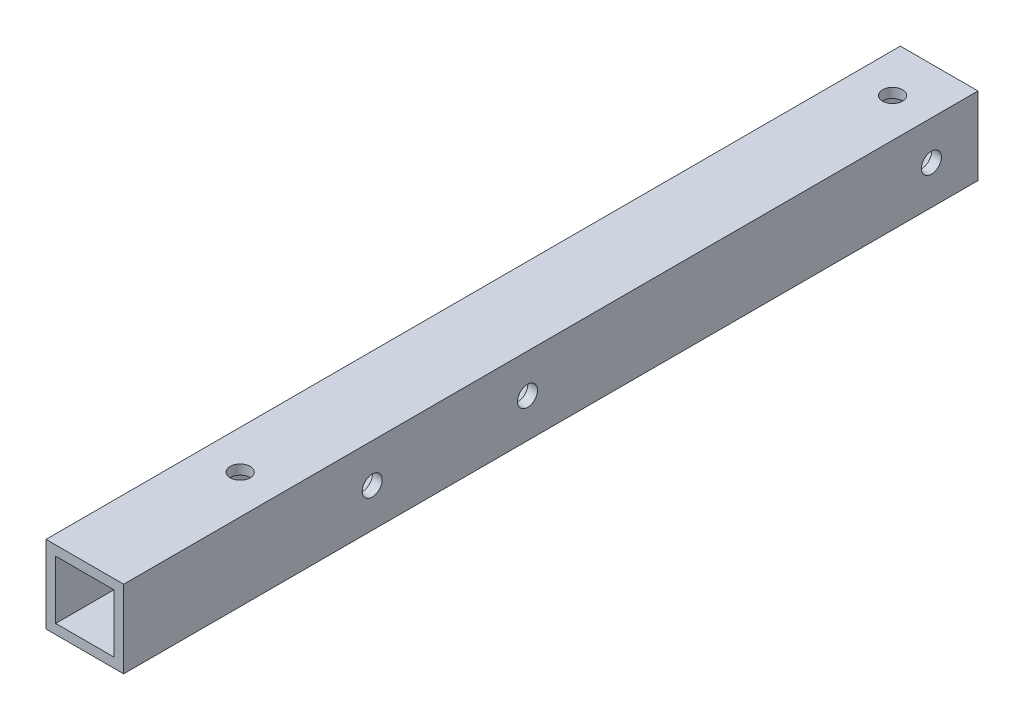
ISO-10303-21;
HEADER;
FILE_DESCRIPTION(('STEP AP214'),'2;1');
FILE_NAME('part.step','',(''),(''),'','','');
FILE_SCHEMA(('AUTOMOTIVE_DESIGN { 1 0 10303 214 1 1 1 1 }'));
ENDSEC;
DATA;
#1=APPLICATION_CONTEXT('core data for automotive mechanical design processes');
#2=APPLICATION_PROTOCOL_DEFINITION('international standard','automotive_design',2000,#1);
#3=PRODUCT_CONTEXT('',#1,'mechanical');
#4=PRODUCT('Part','Part','',(#3));
#5=PRODUCT_RELATED_PRODUCT_CATEGORY('part','',(#4));
#6=PRODUCT_DEFINITION_FORMATION('','',#4);
#7=PRODUCT_DEFINITION_CONTEXT('part definition',#1,'design');
#8=PRODUCT_DEFINITION('design','',#6,#7);
#9=PRODUCT_DEFINITION_SHAPE('','',#8);
#10=(LENGTH_UNIT() NAMED_UNIT(*) SI_UNIT(.MILLI.,.METRE.));
#11=(NAMED_UNIT(*) PLANE_ANGLE_UNIT() SI_UNIT($,.RADIAN.));
#12=(NAMED_UNIT(*) SI_UNIT($,.STERADIAN.) SOLID_ANGLE_UNIT());
#13=UNCERTAINTY_MEASURE_WITH_UNIT(LENGTH_MEASURE(1.E-05),#10,'distance_accuracy_value','');
#14=(GEOMETRIC_REPRESENTATION_CONTEXT(3) GLOBAL_UNCERTAINTY_ASSIGNED_CONTEXT((#13)) GLOBAL_UNIT_ASSIGNED_CONTEXT((#10,
#11,#12)) REPRESENTATION_CONTEXT('',''));
#15=CARTESIAN_POINT('',(0.,0.,0.));
#16=DIRECTION('',(0.,0.,1.));
#17=DIRECTION('',(1.,0.,0.));
#18=AXIS2_PLACEMENT_3D('',#15,#16,#17);
#19=CARTESIAN_POINT('',(0.,0.,279.4));
#20=DIRECTION('',(0.,0.,-1.));
#21=DIRECTION('',(-1.,0.,0.));
#22=AXIS2_PLACEMENT_3D('',#19,#20,#21);
#23=PLANE('',#22);
#24=DIRECTION('',(-1.,0.,0.));
#25=VECTOR('',#24,1.);
#26=CARTESIAN_POINT('',(12.7000000000001,-12.7,279.4));
#27=LINE('',#26,#25);
#28=CARTESIAN_POINT('',(12.7000000000001,-12.7,279.4));
#29=VERTEX_POINT('',#28);
#30=CARTESIAN_POINT('',(-12.6999999999999,-12.7,279.4));
#31=VERTEX_POINT('',#30);
#32=EDGE_CURVE('E143',#29,#31,#27,.T.);
#33=ORIENTED_EDGE('',*,*,#32,.F.);
#34=DIRECTION('',(0.,1.,0.));
#35=VECTOR('',#34,1.);
#36=CARTESIAN_POINT('',(12.7000000000001,-12.7,279.4));
#37=LINE('',#36,#35);
#38=CARTESIAN_POINT('',(12.7000000000001,12.7,279.4));
#39=VERTEX_POINT('',#38);
#40=EDGE_CURVE('E152',#29,#39,#37,.T.);
#41=ORIENTED_EDGE('',*,*,#40,.T.);
#42=DIRECTION('',(-1.,0.,0.));
#43=VECTOR('',#42,1.);
#44=CARTESIAN_POINT('',(12.7000000000001,12.7,279.4));
#45=LINE('',#44,#43);
#46=CARTESIAN_POINT('',(-12.6999999999999,12.7,279.4));
#47=VERTEX_POINT('',#46);
#48=EDGE_CURVE('E150',#39,#47,#45,.T.);
#49=ORIENTED_EDGE('',*,*,#48,.T.);
#50=DIRECTION('',(0.,1.,0.));
#51=VECTOR('',#50,1.);
#52=CARTESIAN_POINT('',(-12.6999999999999,-12.7,279.4));
#53=LINE('',#52,#51);
#54=EDGE_CURVE('E146',#31,#47,#53,.T.);
#55=ORIENTED_EDGE('',*,*,#54,.F.);
#56=EDGE_LOOP('',(#33,#41,#49,#55));
#57=FACE_BOUND('',#56,.T.);
#58=DIRECTION('',(0.,1.,0.));
#59=VECTOR('',#58,1.);
#60=CARTESIAN_POINT('',(9.52500000000005,-9.52499999999999,279.4));
#61=LINE('',#60,#59);
#62=CARTESIAN_POINT('',(9.52500000000005,-9.52499999999999,279.4));
#63=VERTEX_POINT('',#62);
#64=CARTESIAN_POINT('',(9.52500000000005,9.52499999999999,279.4));
#65=VERTEX_POINT('',#64);
#66=EDGE_CURVE('E105',#63,#65,#61,.T.);
#67=ORIENTED_EDGE('',*,*,#66,.F.);
#68=DIRECTION('',(1.,0.,0.));
#69=VECTOR('',#68,1.);
#70=CARTESIAN_POINT('',(-9.52500000000006,-9.52499999999999,279.4));
#71=LINE('',#70,#69);
#72=CARTESIAN_POINT('',(-9.52500000000006,-9.52499999999999,279.4));
#73=VERTEX_POINT('',#72);
#74=EDGE_CURVE('E127',#73,#63,#71,.T.);
#75=ORIENTED_EDGE('',*,*,#74,.F.);
#76=DIRECTION('',(0.,-1.,0.));
#77=VECTOR('',#76,1.);
#78=CARTESIAN_POINT('',(-9.52500000000006,-9.52499999999999,279.4));
#79=LINE('',#78,#77);
#80=CARTESIAN_POINT('',(-9.52500000000006,9.52499999999999,279.4));
#81=VERTEX_POINT('',#80);
#82=EDGE_CURVE('E125',#81,#73,#79,.T.);
#83=ORIENTED_EDGE('',*,*,#82,.F.);
#84=DIRECTION('',(-1.,0.,0.));
#85=VECTOR('',#84,1.);
#86=CARTESIAN_POINT('',(-9.52500000000006,9.52499999999999,279.4));
#87=LINE('',#86,#85);
#88=EDGE_CURVE('E113',#65,#81,#87,.T.);
#89=ORIENTED_EDGE('',*,*,#88,.F.);
#90=EDGE_LOOP('',(#67,#75,#83,#89));
#91=FACE_BOUND('',#90,.T.);
#92=ADVANCED_FACE('F39',(#57,#91),#23,.F.);
#93=CARTESIAN_POINT('',(0.,0.,0.));
#94=DIRECTION('',(0.,0.,-1.));
#95=DIRECTION('',(-1.,0.,0.));
#96=AXIS2_PLACEMENT_3D('',#93,#94,#95);
#97=PLANE('',#96);
#98=DIRECTION('',(-1.,0.,0.));
#99=VECTOR('',#98,1.);
#100=CARTESIAN_POINT('',(12.7000000000001,-12.7,0.));
#101=LINE('',#100,#99);
#102=CARTESIAN_POINT('',(12.7000000000001,-12.7,0.));
#103=VERTEX_POINT('',#102);
#104=CARTESIAN_POINT('',(-12.6999999999999,-12.7,0.));
#105=VERTEX_POINT('',#104);
#106=EDGE_CURVE('E121',#103,#105,#101,.T.);
#107=ORIENTED_EDGE('',*,*,#106,.T.);
#108=DIRECTION('',(0.,1.,0.));
#109=VECTOR('',#108,1.);
#110=CARTESIAN_POINT('',(-12.6999999999999,-12.7,0.));
#111=LINE('',#110,#109);
#112=CARTESIAN_POINT('',(-12.6999999999999,12.7,0.));
#113=VERTEX_POINT('',#112);
#114=EDGE_CURVE('E157',#105,#113,#111,.T.);
#115=ORIENTED_EDGE('',*,*,#114,.T.);
#116=DIRECTION('',(-1.,0.,0.));
#117=VECTOR('',#116,1.);
#118=CARTESIAN_POINT('',(12.7000000000001,12.7,0.));
#119=LINE('',#118,#117);
#120=CARTESIAN_POINT('',(12.7000000000001,12.7,0.));
#121=VERTEX_POINT('',#120);
#122=EDGE_CURVE('E160',#121,#113,#119,.T.);
#123=ORIENTED_EDGE('',*,*,#122,.F.);
#124=DIRECTION('',(0.,1.,0.));
#125=VECTOR('',#124,1.);
#126=CARTESIAN_POINT('',(12.7000000000001,-12.7,0.));
#127=LINE('',#126,#125);
#128=EDGE_CURVE('E147',#103,#121,#127,.T.);
#129=ORIENTED_EDGE('',*,*,#128,.F.);
#130=EDGE_LOOP('',(#107,#115,#123,#129));
#131=FACE_BOUND('',#130,.T.);
#132=DIRECTION('',(1.,0.,0.));
#133=VECTOR('',#132,1.);
#134=CARTESIAN_POINT('',(-9.52500000000006,-9.52499999999999,0.));
#135=LINE('',#134,#133);
#136=CARTESIAN_POINT('',(-9.52500000000006,-9.52499999999999,0.));
#137=VERTEX_POINT('',#136);
#138=CARTESIAN_POINT('',(9.52500000000005,-9.52499999999999,0.));
#139=VERTEX_POINT('',#138);
#140=EDGE_CURVE('E114',#137,#139,#135,.T.);
#141=ORIENTED_EDGE('',*,*,#140,.T.);
#142=DIRECTION('',(0.,1.,0.));
#143=VECTOR('',#142,1.);
#144=CARTESIAN_POINT('',(9.52500000000005,-9.52499999999999,0.));
#145=LINE('',#144,#143);
#146=CARTESIAN_POINT('',(9.52500000000005,9.52499999999999,0.));
#147=VERTEX_POINT('',#146);
#148=EDGE_CURVE('E64',#139,#147,#145,.T.);
#149=ORIENTED_EDGE('',*,*,#148,.T.);
#150=DIRECTION('',(-1.,0.,0.));
#151=VECTOR('',#150,1.);
#152=CARTESIAN_POINT('',(-9.52500000000006,9.52499999999999,0.));
#153=LINE('',#152,#151);
#154=CARTESIAN_POINT('',(-9.52500000000006,9.52499999999999,0.));
#155=VERTEX_POINT('',#154);
#156=EDGE_CURVE('E120',#147,#155,#153,.T.);
#157=ORIENTED_EDGE('',*,*,#156,.T.);
#158=DIRECTION('',(0.,-1.,0.));
#159=VECTOR('',#158,1.);
#160=CARTESIAN_POINT('',(-9.52500000000006,-9.52499999999999,0.));
#161=LINE('',#160,#159);
#162=EDGE_CURVE('E135',#155,#137,#161,.T.);
#163=ORIENTED_EDGE('',*,*,#162,.T.);
#164=EDGE_LOOP('',(#141,#149,#157,#163));
#165=FACE_BOUND('',#164,.T.);
#166=ADVANCED_FACE('F247',(#131,#165),#97,.T.);
#167=CARTESIAN_POINT('',(12.7000000000001,-12.7,279.4));
#168=DIRECTION('',(0.,-1.,0.));
#169=DIRECTION('',(0.,0.,-1.));
#170=AXIS2_PLACEMENT_3D('',#167,#168,#169);
#171=PLANE('',#170);
#172=CARTESIAN_POINT('',(0.,-12.7,228.6));
#173=DIRECTION('',(0.,1.,0.));
#174=DIRECTION('',(0.,0.,1.));
#175=AXIS2_PLACEMENT_3D('',#172,#173,#174);
#176=CIRCLE('',#175,3.2639);
#177=CARTESIAN_POINT('',(0.,-12.7,231.8639));
#178=VERTEX_POINT('',#177);
#179=EDGE_CURVE('E177',#178,#178,#176,.T.);
#180=ORIENTED_EDGE('',*,*,#179,.T.);
#181=EDGE_LOOP('',(#180));
#182=FACE_BOUND('',#181,.T.);
#183=CARTESIAN_POINT('',(0.,-12.7,15.24));
#184=DIRECTION('',(0.,1.,0.));
#185=DIRECTION('',(0.,0.,1.));
#186=AXIS2_PLACEMENT_3D('',#183,#184,#185);
#187=CIRCLE('',#186,3.2639);
#188=CARTESIAN_POINT('',(0.,-12.7,18.5039));
#189=VERTEX_POINT('',#188);
#190=EDGE_CURVE('E172',#189,#189,#187,.T.);
#191=ORIENTED_EDGE('',*,*,#190,.T.);
#192=EDGE_LOOP('',(#191));
#193=FACE_BOUND('',#192,.T.);
#194=ORIENTED_EDGE('',*,*,#106,.F.);
#195=DIRECTION('',(0.,0.,-1.));
#196=VECTOR('',#195,1.);
#197=CARTESIAN_POINT('',(12.7000000000001,-12.7,279.4));
#198=LINE('',#197,#196);
#199=EDGE_CURVE('E11',#29,#103,#198,.T.);
#200=ORIENTED_EDGE('',*,*,#199,.F.);
#201=ORIENTED_EDGE('',*,*,#32,.T.);
#202=DIRECTION('',(0.,0.,-1.));
#203=VECTOR('',#202,1.);
#204=CARTESIAN_POINT('',(-12.6999999999999,-12.7,279.4));
#205=LINE('',#204,#203);
#206=EDGE_CURVE('E154',#31,#105,#205,.T.);
#207=ORIENTED_EDGE('',*,*,#206,.T.);
#208=EDGE_LOOP('',(#194,#200,#201,#207));
#209=FACE_BOUND('',#208,.T.);
#210=ADVANCED_FACE('F41',(#182,#193,#209),#171,.T.);
#211=CARTESIAN_POINT('',(12.7000000000001,-12.7,279.4));
#212=DIRECTION('',(-1.,0.,0.));
#213=DIRECTION('',(0.,0.,1.));
#214=AXIS2_PLACEMENT_3D('',#211,#212,#213);
#215=PLANE('',#214);
#216=CARTESIAN_POINT('',(12.7000000000001,0.,198.12));
#217=DIRECTION('',(-1.,0.,0.));
#218=DIRECTION('',(0.,0.,1.));
#219=AXIS2_PLACEMENT_3D('',#216,#217,#218);
#220=CIRCLE('',#219,3.26389999999998);
#221=CARTESIAN_POINT('',(12.7000000000001,0.,201.3839));
#222=VERTEX_POINT('',#221);
#223=EDGE_CURVE('E185',#222,#222,#220,.T.);
#224=ORIENTED_EDGE('',*,*,#223,.T.);
#225=EDGE_LOOP('',(#224));
#226=FACE_BOUND('',#225,.T.);
#227=CARTESIAN_POINT('',(12.7000000000001,0.,147.32));
#228=DIRECTION('',(-1.,0.,0.));
#229=DIRECTION('',(0.,0.,1.));
#230=AXIS2_PLACEMENT_3D('',#227,#228,#229);
#231=CIRCLE('',#230,3.26389999999998);
#232=CARTESIAN_POINT('',(12.7000000000001,0.,150.5839));
#233=VERTEX_POINT('',#232);
#234=EDGE_CURVE('E196',#233,#233,#231,.T.);
#235=ORIENTED_EDGE('',*,*,#234,.T.);
#236=EDGE_LOOP('',(#235));
#237=FACE_BOUND('',#236,.T.);
#238=CARTESIAN_POINT('',(12.7000000000001,0.,15.24));
#239=DIRECTION('',(-1.,0.,0.));
#240=DIRECTION('',(0.,0.,1.));
#241=AXIS2_PLACEMENT_3D('',#238,#239,#240);
#242=CIRCLE('',#241,3.2639);
#243=CARTESIAN_POINT('',(12.7000000000001,0.,18.5039));
#244=VERTEX_POINT('',#243);
#245=EDGE_CURVE('E181',#244,#244,#242,.T.);
#246=ORIENTED_EDGE('',*,*,#245,.T.);
#247=EDGE_LOOP('',(#246));
#248=FACE_BOUND('',#247,.T.);
#249=ORIENTED_EDGE('',*,*,#128,.T.);
#250=DIRECTION('',(0.,0.,-1.));
#251=VECTOR('',#250,1.);
#252=CARTESIAN_POINT('',(12.7000000000001,12.7,279.4));
#253=LINE('',#252,#251);
#254=EDGE_CURVE('E48',#39,#121,#253,.T.);
#255=ORIENTED_EDGE('',*,*,#254,.F.);
#256=ORIENTED_EDGE('',*,*,#40,.F.);
#257=ORIENTED_EDGE('',*,*,#199,.T.);
#258=EDGE_LOOP('',(#249,#255,#256,#257));
#259=FACE_BOUND('',#258,.T.);
#260=ADVANCED_FACE('F257',(#226,#237,#248,#259),#215,.F.);
#261=CARTESIAN_POINT('',(12.7000000000001,12.7,279.4));
#262=DIRECTION('',(0.,-1.,0.));
#263=DIRECTION('',(0.,0.,-1.));
#264=AXIS2_PLACEMENT_3D('',#261,#262,#263);
#265=PLANE('',#264);
#266=CARTESIAN_POINT('',(0.,12.7,228.6));
#267=DIRECTION('',(0.,1.,0.));
#268=DIRECTION('',(0.,0.,1.));
#269=AXIS2_PLACEMENT_3D('',#266,#267,#268);
#270=CIRCLE('',#269,3.2639);
#271=CARTESIAN_POINT('',(0.,12.7,231.8639));
#272=VERTEX_POINT('',#271);
#273=EDGE_CURVE('E214',#272,#272,#270,.T.);
#274=ORIENTED_EDGE('',*,*,#273,.F.);
#275=EDGE_LOOP('',(#274));
#276=FACE_BOUND('',#275,.T.);
#277=CARTESIAN_POINT('',(0.,12.7,15.24));
#278=DIRECTION('',(0.,1.,0.));
#279=DIRECTION('',(0.,0.,1.));
#280=AXIS2_PLACEMENT_3D('',#277,#278,#279);
#281=CIRCLE('',#280,3.2639);
#282=CARTESIAN_POINT('',(0.,12.7,18.5039));
#283=VERTEX_POINT('',#282);
#284=EDGE_CURVE('E221',#283,#283,#281,.T.);
#285=ORIENTED_EDGE('',*,*,#284,.F.);
#286=EDGE_LOOP('',(#285));
#287=FACE_BOUND('',#286,.T.);
#288=ORIENTED_EDGE('',*,*,#122,.T.);
#289=DIRECTION('',(0.,0.,-1.));
#290=VECTOR('',#289,1.);
#291=CARTESIAN_POINT('',(-12.6999999999999,12.7,279.4));
#292=LINE('',#291,#290);
#293=EDGE_CURVE('E166',#47,#113,#292,.T.);
#294=ORIENTED_EDGE('',*,*,#293,.F.);
#295=ORIENTED_EDGE('',*,*,#48,.F.);
#296=ORIENTED_EDGE('',*,*,#254,.T.);
#297=EDGE_LOOP('',(#288,#294,#295,#296));
#298=FACE_BOUND('',#297,.T.);
#299=ADVANCED_FACE('F260',(#276,#287,#298),#265,.F.);
#300=CARTESIAN_POINT('',(-12.6999999999999,-12.7,279.4));
#301=DIRECTION('',(-1.,0.,0.));
#302=DIRECTION('',(0.,0.,1.));
#303=AXIS2_PLACEMENT_3D('',#300,#301,#302);
#304=PLANE('',#303);
#305=CARTESIAN_POINT('',(-12.6999999999999,0.,198.12));
#306=DIRECTION('',(-1.,0.,0.));
#307=DIRECTION('',(0.,0.,1.));
#308=AXIS2_PLACEMENT_3D('',#305,#306,#307);
#309=CIRCLE('',#308,3.26389999999998);
#310=CARTESIAN_POINT('',(-12.6999999999999,0.,201.3839));
#311=VERTEX_POINT('',#310);
#312=EDGE_CURVE('E191',#311,#311,#309,.T.);
#313=ORIENTED_EDGE('',*,*,#312,.F.);
#314=EDGE_LOOP('',(#313));
#315=FACE_BOUND('',#314,.T.);
#316=CARTESIAN_POINT('',(-12.6999999999999,0.,147.32));
#317=DIRECTION('',(-1.,0.,0.));
#318=DIRECTION('',(0.,0.,1.));
#319=AXIS2_PLACEMENT_3D('',#316,#317,#318);
#320=CIRCLE('',#319,3.26389999999998);
#321=CARTESIAN_POINT('',(-12.6999999999999,0.,150.5839));
#322=VERTEX_POINT('',#321);
#323=EDGE_CURVE('E201',#322,#322,#320,.T.);
#324=ORIENTED_EDGE('',*,*,#323,.F.);
#325=EDGE_LOOP('',(#324));
#326=FACE_BOUND('',#325,.T.);
#327=CARTESIAN_POINT('',(-12.6999999999999,0.,15.24));
#328=DIRECTION('',(-1.,0.,0.));
#329=DIRECTION('',(0.,0.,1.));
#330=AXIS2_PLACEMENT_3D('',#327,#328,#329);
#331=CIRCLE('',#330,3.2639);
#332=CARTESIAN_POINT('',(-12.6999999999999,0.,18.5039));
#333=VERTEX_POINT('',#332);
#334=EDGE_CURVE('E207',#333,#333,#331,.T.);
#335=ORIENTED_EDGE('',*,*,#334,.F.);
#336=EDGE_LOOP('',(#335));
#337=FACE_BOUND('',#336,.T.);
#338=ORIENTED_EDGE('',*,*,#114,.F.);
#339=ORIENTED_EDGE('',*,*,#206,.F.);
#340=ORIENTED_EDGE('',*,*,#54,.T.);
#341=ORIENTED_EDGE('',*,*,#293,.T.);
#342=EDGE_LOOP('',(#338,#339,#340,#341));
#343=FACE_BOUND('',#342,.T.);
#344=ADVANCED_FACE('F242',(#315,#326,#337,#343),#304,.T.);
#345=CARTESIAN_POINT('',(9.52500000000005,-9.52499999999999,279.4));
#346=DIRECTION('',(-1.,0.,0.));
#347=DIRECTION('',(0.,0.,1.));
#348=AXIS2_PLACEMENT_3D('',#345,#346,#347);
#349=PLANE('',#348);
#350=CARTESIAN_POINT('',(9.52500000000005,0.,198.12));
#351=DIRECTION('',(-1.,0.,0.));
#352=DIRECTION('',(0.,0.,1.));
#353=AXIS2_PLACEMENT_3D('',#350,#351,#352);
#354=CIRCLE('',#353,3.26389999999998);
#355=CARTESIAN_POINT('',(9.52500000000005,0.,201.3839));
#356=VERTEX_POINT('',#355);
#357=EDGE_CURVE('E204',#356,#356,#354,.T.);
#358=ORIENTED_EDGE('',*,*,#357,.F.);
#359=EDGE_LOOP('',(#358));
#360=FACE_BOUND('',#359,.T.);
#361=CARTESIAN_POINT('',(9.52500000000005,0.,147.32));
#362=DIRECTION('',(-1.,0.,0.));
#363=DIRECTION('',(0.,0.,1.));
#364=AXIS2_PLACEMENT_3D('',#361,#362,#363);
#365=CIRCLE('',#364,3.26389999999998);
#366=CARTESIAN_POINT('',(9.52500000000005,0.,150.5839));
#367=VERTEX_POINT('',#366);
#368=EDGE_CURVE('E184',#367,#367,#365,.T.);
#369=ORIENTED_EDGE('',*,*,#368,.F.);
#370=EDGE_LOOP('',(#369));
#371=FACE_BOUND('',#370,.T.);
#372=CARTESIAN_POINT('',(9.52500000000005,0.,15.24));
#373=DIRECTION('',(-1.,0.,0.));
#374=DIRECTION('',(0.,0.,1.));
#375=AXIS2_PLACEMENT_3D('',#372,#373,#374);
#376=CIRCLE('',#375,3.2639);
#377=CARTESIAN_POINT('',(9.52500000000005,0.,18.5039));
#378=VERTEX_POINT('',#377);
#379=EDGE_CURVE('E180',#378,#378,#376,.T.);
#380=ORIENTED_EDGE('',*,*,#379,.F.);
#381=EDGE_LOOP('',(#380));
#382=FACE_BOUND('',#381,.T.);
#383=ORIENTED_EDGE('',*,*,#148,.F.);
#384=DIRECTION('',(0.,0.,-1.));
#385=VECTOR('',#384,1.);
#386=CARTESIAN_POINT('',(9.52500000000005,-9.52499999999999,279.4));
#387=LINE('',#386,#385);
#388=EDGE_CURVE('E109',#63,#139,#387,.T.);
#389=ORIENTED_EDGE('',*,*,#388,.F.);
#390=ORIENTED_EDGE('',*,*,#66,.T.);
#391=DIRECTION('',(0.,0.,-1.));
#392=VECTOR('',#391,1.);
#393=CARTESIAN_POINT('',(9.52500000000005,9.52499999999999,279.4));
#394=LINE('',#393,#392);
#395=EDGE_CURVE('E108',#65,#147,#394,.T.);
#396=ORIENTED_EDGE('',*,*,#395,.T.);
#397=EDGE_LOOP('',(#383,#389,#390,#396));
#398=FACE_BOUND('',#397,.T.);
#399=ADVANCED_FACE('F107',(#360,#371,#382,#398),#349,.T.);
#400=CARTESIAN_POINT('',(-9.52500000000006,9.52499999999999,279.4));
#401=DIRECTION('',(0.,-1.,0.));
#402=DIRECTION('',(0.,0.,-1.));
#403=AXIS2_PLACEMENT_3D('',#400,#401,#402);
#404=PLANE('',#403);
#405=CARTESIAN_POINT('',(0.,9.52499999999999,228.6));
#406=DIRECTION('',(0.,-1.,0.));
#407=DIRECTION('',(0.,0.,-1.));
#408=AXIS2_PLACEMENT_3D('',#405,#406,#407);
#409=CIRCLE('',#408,3.2639);
#410=CARTESIAN_POINT('',(0.,9.52499999999999,225.3361));
#411=VERTEX_POINT('',#410);
#412=EDGE_CURVE('E176',#411,#411,#409,.T.);
#413=ORIENTED_EDGE('',*,*,#412,.F.);
#414=EDGE_LOOP('',(#413));
#415=FACE_BOUND('',#414,.T.);
#416=CARTESIAN_POINT('',(0.,9.52499999999999,15.24));
#417=DIRECTION('',(0.,-1.,0.));
#418=DIRECTION('',(0.,0.,-1.));
#419=AXIS2_PLACEMENT_3D('',#416,#417,#418);
#420=CIRCLE('',#419,3.2639);
#421=CARTESIAN_POINT('',(0.,9.52499999999999,11.9761));
#422=VERTEX_POINT('',#421);
#423=EDGE_CURVE('E133',#422,#422,#420,.T.);
#424=ORIENTED_EDGE('',*,*,#423,.F.);
#425=EDGE_LOOP('',(#424));
#426=FACE_BOUND('',#425,.T.);
#427=ORIENTED_EDGE('',*,*,#156,.F.);
#428=ORIENTED_EDGE('',*,*,#395,.F.);
#429=ORIENTED_EDGE('',*,*,#88,.T.);
#430=DIRECTION('',(0.,0.,-1.));
#431=VECTOR('',#430,1.);
#432=CARTESIAN_POINT('',(-9.52500000000006,9.52499999999999,279.4));
#433=LINE('',#432,#431);
#434=EDGE_CURVE('E122',#81,#155,#433,.T.);
#435=ORIENTED_EDGE('',*,*,#434,.T.);
#436=EDGE_LOOP('',(#427,#428,#429,#435));
#437=FACE_BOUND('',#436,.T.);
#438=ADVANCED_FACE('F117',(#415,#426,#437),#404,.T.);
#439=CARTESIAN_POINT('',(-9.52500000000006,-9.52499999999999,279.4));
#440=DIRECTION('',(1.,0.,0.));
#441=DIRECTION('',(0.,0.,-1.));
#442=AXIS2_PLACEMENT_3D('',#439,#440,#441);
#443=PLANE('',#442);
#444=CARTESIAN_POINT('',(-9.52500000000006,0.,198.12));
#445=DIRECTION('',(1.,0.,0.));
#446=DIRECTION('',(0.,0.,-1.));
#447=AXIS2_PLACEMENT_3D('',#444,#445,#446);
#448=CIRCLE('',#447,3.26389999999998);
#449=CARTESIAN_POINT('',(-9.52500000000006,0.,194.8561));
#450=VERTEX_POINT('',#449);
#451=EDGE_CURVE('E43',#450,#450,#448,.T.);
#452=ORIENTED_EDGE('',*,*,#451,.F.);
#453=EDGE_LOOP('',(#452));
#454=FACE_BOUND('',#453,.T.);
#455=CARTESIAN_POINT('',(-9.52500000000006,0.,147.32));
#456=DIRECTION('',(1.,0.,0.));
#457=DIRECTION('',(0.,0.,-1.));
#458=AXIS2_PLACEMENT_3D('',#455,#456,#457);
#459=CIRCLE('',#458,3.26389999999998);
#460=CARTESIAN_POINT('',(-9.52500000000006,0.,144.0561));
#461=VERTEX_POINT('',#460);
#462=EDGE_CURVE('E182',#461,#461,#459,.T.);
#463=ORIENTED_EDGE('',*,*,#462,.F.);
#464=EDGE_LOOP('',(#463));
#465=FACE_BOUND('',#464,.T.);
#466=CARTESIAN_POINT('',(-9.52500000000006,0.,15.24));
#467=DIRECTION('',(1.,0.,0.));
#468=DIRECTION('',(0.,0.,-1.));
#469=AXIS2_PLACEMENT_3D('',#466,#467,#468);
#470=CIRCLE('',#469,3.2639);
#471=CARTESIAN_POINT('',(-9.52500000000006,0.,11.9761));
#472=VERTEX_POINT('',#471);
#473=EDGE_CURVE('E178',#472,#472,#470,.T.);
#474=ORIENTED_EDGE('',*,*,#473,.F.);
#475=EDGE_LOOP('',(#474));
#476=FACE_BOUND('',#475,.T.);
#477=ORIENTED_EDGE('',*,*,#162,.F.);
#478=ORIENTED_EDGE('',*,*,#434,.F.);
#479=ORIENTED_EDGE('',*,*,#82,.T.);
#480=DIRECTION('',(0.,0.,-1.));
#481=VECTOR('',#480,1.);
#482=CARTESIAN_POINT('',(-9.52500000000006,-9.52499999999999,279.4));
#483=LINE('',#482,#481);
#484=EDGE_CURVE('E56',#73,#137,#483,.T.);
#485=ORIENTED_EDGE('',*,*,#484,.T.);
#486=EDGE_LOOP('',(#477,#478,#479,#485));
#487=FACE_BOUND('',#486,.T.);
#488=ADVANCED_FACE('F232',(#454,#465,#476,#487),#443,.T.);
#489=CARTESIAN_POINT('',(-9.52500000000006,-9.52499999999999,279.4));
#490=DIRECTION('',(0.,1.,0.));
#491=DIRECTION('',(0.,0.,1.));
#492=AXIS2_PLACEMENT_3D('',#489,#490,#491);
#493=PLANE('',#492);
#494=CARTESIAN_POINT('',(0.,-9.52499999999999,228.6));
#495=DIRECTION('',(0.,1.,0.));
#496=DIRECTION('',(0.,0.,1.));
#497=AXIS2_PLACEMENT_3D('',#494,#495,#496);
#498=CIRCLE('',#497,3.2639);
#499=CARTESIAN_POINT('',(0.,-9.52499999999999,231.8639));
#500=VERTEX_POINT('',#499);
#501=EDGE_CURVE('E173',#500,#500,#498,.T.);
#502=ORIENTED_EDGE('',*,*,#501,.F.);
#503=EDGE_LOOP('',(#502));
#504=FACE_BOUND('',#503,.T.);
#505=CARTESIAN_POINT('',(0.,-9.52499999999999,15.24));
#506=DIRECTION('',(0.,1.,0.));
#507=DIRECTION('',(0.,0.,1.));
#508=AXIS2_PLACEMENT_3D('',#505,#506,#507);
#509=CIRCLE('',#508,3.2639);
#510=CARTESIAN_POINT('',(0.,-9.52499999999999,18.5039));
#511=VERTEX_POINT('',#510);
#512=EDGE_CURVE('E169',#511,#511,#509,.T.);
#513=ORIENTED_EDGE('',*,*,#512,.F.);
#514=EDGE_LOOP('',(#513));
#515=FACE_BOUND('',#514,.T.);
#516=ORIENTED_EDGE('',*,*,#140,.F.);
#517=ORIENTED_EDGE('',*,*,#484,.F.);
#518=ORIENTED_EDGE('',*,*,#74,.T.);
#519=ORIENTED_EDGE('',*,*,#388,.T.);
#520=EDGE_LOOP('',(#516,#517,#518,#519));
#521=FACE_BOUND('',#520,.T.);
#522=ADVANCED_FACE('F239',(#504,#515,#521),#493,.T.);
#523=CARTESIAN_POINT('',(0.,-12.7,15.24));
#524=DIRECTION('',(0.,1.,0.));
#525=DIRECTION('',(0.,0.,1.));
#526=AXIS2_PLACEMENT_3D('',#523,#524,#525);
#527=CYLINDRICAL_SURFACE('',#526,3.2639);
#528=ORIENTED_EDGE('',*,*,#512,.T.);
#529=EDGE_LOOP('',(#528));
#530=FACE_BOUND('',#529,.T.);
#531=ORIENTED_EDGE('',*,*,#190,.F.);
#532=EDGE_LOOP('',(#531));
#533=FACE_BOUND('',#532,.T.);
#534=ADVANCED_FACE('F294',(#530,#533),#527,.F.);
#535=ORIENTED_EDGE('',*,*,#423,.T.);
#536=EDGE_LOOP('',(#535));
#537=FACE_BOUND('',#536,.T.);
#538=ORIENTED_EDGE('',*,*,#284,.T.);
#539=EDGE_LOOP('',(#538));
#540=FACE_BOUND('',#539,.T.);
#541=ADVANCED_FACE('F228',(#537,#540),#527,.F.);
#542=CARTESIAN_POINT('',(0.,-12.7,228.6));
#543=DIRECTION('',(0.,1.,0.));
#544=DIRECTION('',(0.,0.,1.));
#545=AXIS2_PLACEMENT_3D('',#542,#543,#544);
#546=CYLINDRICAL_SURFACE('',#545,3.2639);
#547=ORIENTED_EDGE('',*,*,#501,.T.);
#548=EDGE_LOOP('',(#547));
#549=FACE_BOUND('',#548,.T.);
#550=ORIENTED_EDGE('',*,*,#179,.F.);
#551=EDGE_LOOP('',(#550));
#552=FACE_BOUND('',#551,.T.);
#553=ADVANCED_FACE('F302',(#549,#552),#546,.F.);
#554=ORIENTED_EDGE('',*,*,#412,.T.);
#555=EDGE_LOOP('',(#554));
#556=FACE_BOUND('',#555,.T.);
#557=ORIENTED_EDGE('',*,*,#273,.T.);
#558=EDGE_LOOP('',(#557));
#559=FACE_BOUND('',#558,.T.);
#560=ADVANCED_FACE('F308',(#556,#559),#546,.F.);
#561=CARTESIAN_POINT('',(12.7000000000001,0.,15.24));
#562=DIRECTION('',(-1.,0.,0.));
#563=DIRECTION('',(0.,0.,1.));
#564=AXIS2_PLACEMENT_3D('',#561,#562,#563);
#565=CYLINDRICAL_SURFACE('',#564,3.2639);
#566=ORIENTED_EDGE('',*,*,#473,.T.);
#567=EDGE_LOOP('',(#566));
#568=FACE_BOUND('',#567,.T.);
#569=ORIENTED_EDGE('',*,*,#334,.T.);
#570=EDGE_LOOP('',(#569));
#571=FACE_BOUND('',#570,.T.);
#572=ADVANCED_FACE('F310',(#568,#571),#565,.F.);
#573=ORIENTED_EDGE('',*,*,#379,.T.);
#574=EDGE_LOOP('',(#573));
#575=FACE_BOUND('',#574,.T.);
#576=ORIENTED_EDGE('',*,*,#245,.F.);
#577=EDGE_LOOP('',(#576));
#578=FACE_BOUND('',#577,.T.);
#579=ADVANCED_FACE('F313',(#575,#578),#565,.F.);
#580=CARTESIAN_POINT('',(12.7000000000001,0.,147.32));
#581=DIRECTION('',(-1.,0.,0.));
#582=DIRECTION('',(0.,0.,1.));
#583=AXIS2_PLACEMENT_3D('',#580,#581,#582);
#584=CYLINDRICAL_SURFACE('',#583,3.26389999999998);
#585=ORIENTED_EDGE('',*,*,#462,.T.);
#586=EDGE_LOOP('',(#585));
#587=FACE_BOUND('',#586,.T.);
#588=ORIENTED_EDGE('',*,*,#323,.T.);
#589=EDGE_LOOP('',(#588));
#590=FACE_BOUND('',#589,.T.);
#591=ADVANCED_FACE('F315',(#587,#590),#584,.F.);
#592=CARTESIAN_POINT('',(12.7000000000001,0.,198.12));
#593=DIRECTION('',(-1.,0.,0.));
#594=DIRECTION('',(0.,0.,1.));
#595=AXIS2_PLACEMENT_3D('',#592,#593,#594);
#596=CYLINDRICAL_SURFACE('',#595,3.26389999999998);
#597=ORIENTED_EDGE('',*,*,#451,.T.);
#598=EDGE_LOOP('',(#597));
#599=FACE_BOUND('',#598,.T.);
#600=ORIENTED_EDGE('',*,*,#312,.T.);
#601=EDGE_LOOP('',(#600));
#602=FACE_BOUND('',#601,.T.);
#603=ADVANCED_FACE('F318',(#599,#602),#596,.F.);
#604=ORIENTED_EDGE('',*,*,#368,.T.);
#605=EDGE_LOOP('',(#604));
#606=FACE_BOUND('',#605,.T.);
#607=ORIENTED_EDGE('',*,*,#234,.F.);
#608=EDGE_LOOP('',(#607));
#609=FACE_BOUND('',#608,.T.);
#610=ADVANCED_FACE('F319',(#606,#609),#584,.F.);
#611=ORIENTED_EDGE('',*,*,#357,.T.);
#612=EDGE_LOOP('',(#611));
#613=FACE_BOUND('',#612,.T.);
#614=ORIENTED_EDGE('',*,*,#223,.F.);
#615=EDGE_LOOP('',(#614));
#616=FACE_BOUND('',#615,.T.);
#617=ADVANCED_FACE('F322',(#613,#616),#596,.F.);
#618=CLOSED_SHELL('',(#92,#166,#210,#260,#299,#344,#399,#438,#488,#522,#534,#541,#553,#560,#572,
#579,#591,#603,#610,#617));
#619=MANIFOLD_SOLID_BREP('B2',#618);
#620=ADVANCED_BREP_SHAPE_REPRESENTATION('',(#18,#619),#14);
#621=SHAPE_DEFINITION_REPRESENTATION(#9,#620);
ENDSEC;
END-ISO-10303-21;
